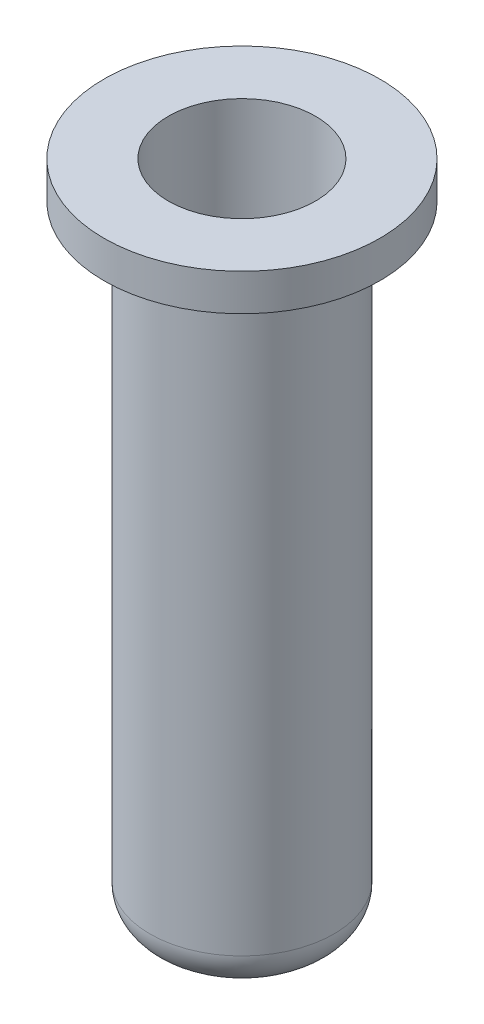
ISO-10303-21;
HEADER;
FILE_DESCRIPTION(('STEP AP214'),'2;1');
FILE_NAME('part.step','',(''),(''),'','','');
FILE_SCHEMA(('AUTOMOTIVE_DESIGN { 1 0 10303 214 1 1 1 1 }'));
ENDSEC;
DATA;
#1=APPLICATION_CONTEXT('core data for automotive mechanical design processes');
#2=APPLICATION_PROTOCOL_DEFINITION('international standard','automotive_design',2000,#1);
#3=PRODUCT_CONTEXT('',#1,'mechanical');
#4=PRODUCT('Part','Part','',(#3));
#5=PRODUCT_RELATED_PRODUCT_CATEGORY('part','',(#4));
#6=PRODUCT_DEFINITION_FORMATION('','',#4);
#7=PRODUCT_DEFINITION_CONTEXT('part definition',#1,'design');
#8=PRODUCT_DEFINITION('design','',#6,#7);
#9=PRODUCT_DEFINITION_SHAPE('','',#8);
#10=(LENGTH_UNIT() NAMED_UNIT(*) SI_UNIT(.MILLI.,.METRE.));
#11=(NAMED_UNIT(*) PLANE_ANGLE_UNIT() SI_UNIT($,.RADIAN.));
#12=(NAMED_UNIT(*) SI_UNIT($,.STERADIAN.) SOLID_ANGLE_UNIT());
#13=UNCERTAINTY_MEASURE_WITH_UNIT(LENGTH_MEASURE(1.E-05),#10,'distance_accuracy_value','');
#14=(GEOMETRIC_REPRESENTATION_CONTEXT(3) GLOBAL_UNCERTAINTY_ASSIGNED_CONTEXT((#13)) GLOBAL_UNIT_ASSIGNED_CONTEXT((#10,
#11,#12)) REPRESENTATION_CONTEXT('',''));
#15=CARTESIAN_POINT('',(0.,0.,0.));
#16=DIRECTION('',(0.,0.,1.));
#17=DIRECTION('',(1.,0.,0.));
#18=AXIS2_PLACEMENT_3D('',#15,#16,#17);
#19=CARTESIAN_POINT('',(0.,18.,0.));
#20=DIRECTION('',(0.,-1.,0.));
#21=DIRECTION('',(0.,0.,-1.));
#22=AXIS2_PLACEMENT_3D('',#19,#20,#21);
#23=CYLINDRICAL_SURFACE('',#22,2.5);
#24=CARTESIAN_POINT('',(0.,1.,0.));
#25=DIRECTION('',(0.,1.,0.));
#26=DIRECTION('',(0.,0.,1.));
#27=AXIS2_PLACEMENT_3D('',#24,#25,#26);
#28=CIRCLE('',#27,2.5);
#29=CARTESIAN_POINT('',(0.,1.,2.5));
#30=VERTEX_POINT('',#29);
#31=EDGE_CURVE('E74',#30,#30,#28,.T.);
#32=ORIENTED_EDGE('',*,*,#31,.T.);
#33=EDGE_LOOP('',(#32));
#34=FACE_BOUND('',#33,.T.);
#35=CARTESIAN_POINT('',(0.,17.,0.));
#36=DIRECTION('',(0.,1.,0.));
#37=DIRECTION('',(0.,0.,1.));
#38=AXIS2_PLACEMENT_3D('',#35,#36,#37);
#39=CIRCLE('',#38,2.5);
#40=CARTESIAN_POINT('',(0.,17.,2.5));
#41=VERTEX_POINT('',#40);
#42=EDGE_CURVE('E11',#41,#41,#39,.T.);
#43=ORIENTED_EDGE('',*,*,#42,.F.);
#44=EDGE_LOOP('',(#43));
#45=FACE_BOUND('',#44,.T.);
#46=ADVANCED_FACE('F39',(#34,#45),#23,.T.);
#47=CARTESIAN_POINT('',(0.,0.,0.));
#48=DIRECTION('',(0.,1.,0.));
#49=DIRECTION('',(0.,0.,1.));
#50=AXIS2_PLACEMENT_3D('',#47,#48,#49);
#51=PLANE('',#50);
#52=CARTESIAN_POINT('',(0.,0.,0.));
#53=DIRECTION('',(0.,1.,0.));
#54=DIRECTION('',(0.,0.,1.));
#55=AXIS2_PLACEMENT_3D('',#52,#53,#54);
#56=CIRCLE('',#55,1.5);
#57=CARTESIAN_POINT('',(0.,0.,1.5));
#58=VERTEX_POINT('',#57);
#59=EDGE_CURVE('E47',#58,#58,#56,.F.);
#60=ORIENTED_EDGE('',*,*,#59,.T.);
#61=EDGE_LOOP('',(#60));
#62=FACE_BOUND('',#61,.T.);
#63=ADVANCED_FACE('F82',(#62),#51,.F.);
#64=CARTESIAN_POINT('',(0.,1.,0.));
#65=DIRECTION('',(0.,1.,0.));
#66=DIRECTION('',(0.,0.,1.));
#67=AXIS2_PLACEMENT_3D('',#64,#65,#66);
#68=TOROIDAL_SURFACE('',#67,1.5,1.);
#69=ORIENTED_EDGE('',*,*,#59,.F.);
#70=EDGE_LOOP('',(#69));
#71=FACE_BOUND('',#70,.T.);
#72=ORIENTED_EDGE('',*,*,#31,.F.);
#73=EDGE_LOOP('',(#72));
#74=FACE_BOUND('',#73,.T.);
#75=ADVANCED_FACE('F41',(#71,#74),#68,.T.);
#76=CARTESIAN_POINT('',(0.,17.,0.));
#77=DIRECTION('',(0.,1.,0.));
#78=DIRECTION('',(0.,0.,1.));
#79=AXIS2_PLACEMENT_3D('',#76,#77,#78);
#80=CYLINDRICAL_SURFACE('',#79,3.75);
#81=CARTESIAN_POINT('',(0.,17.,0.));
#82=DIRECTION('',(0.,1.,0.));
#83=DIRECTION('',(0.,0.,1.));
#84=AXIS2_PLACEMENT_3D('',#81,#82,#83);
#85=CIRCLE('',#84,3.75);
#86=CARTESIAN_POINT('',(0.,17.,3.75));
#87=VERTEX_POINT('',#86);
#88=EDGE_CURVE('E67',#87,#87,#85,.T.);
#89=ORIENTED_EDGE('',*,*,#88,.T.);
#90=EDGE_LOOP('',(#89));
#91=FACE_BOUND('',#90,.T.);
#92=CARTESIAN_POINT('',(0.,18.,0.));
#93=DIRECTION('',(0.,1.,0.));
#94=DIRECTION('',(0.,0.,1.));
#95=AXIS2_PLACEMENT_3D('',#92,#93,#94);
#96=CIRCLE('',#95,3.75);
#97=CARTESIAN_POINT('',(0.,18.,3.75));
#98=VERTEX_POINT('',#97);
#99=EDGE_CURVE('E61',#98,#98,#96,.T.);
#100=ORIENTED_EDGE('',*,*,#99,.F.);
#101=EDGE_LOOP('',(#100));
#102=FACE_BOUND('',#101,.T.);
#103=ADVANCED_FACE('F86',(#91,#102),#80,.T.);
#104=CARTESIAN_POINT('',(0.,17.,0.));
#105=DIRECTION('',(0.,1.,0.));
#106=DIRECTION('',(0.,0.,1.));
#107=AXIS2_PLACEMENT_3D('',#104,#105,#106);
#108=PLANE('',#107);
#109=ORIENTED_EDGE('',*,*,#42,.T.);
#110=EDGE_LOOP('',(#109));
#111=FACE_BOUND('',#110,.T.);
#112=ORIENTED_EDGE('',*,*,#88,.F.);
#113=EDGE_LOOP('',(#112));
#114=FACE_BOUND('',#113,.T.);
#115=ADVANCED_FACE('F93',(#111,#114),#108,.F.);
#116=CARTESIAN_POINT('',(0.,18.,0.));
#117=DIRECTION('',(0.,1.,0.));
#118=DIRECTION('',(0.,0.,1.));
#119=AXIS2_PLACEMENT_3D('',#116,#117,#118);
#120=PLANE('',#119);
#121=CARTESIAN_POINT('',(0.,18.,0.));
#122=DIRECTION('',(0.,1.,0.));
#123=DIRECTION('',(0.,0.,1.));
#124=AXIS2_PLACEMENT_3D('',#121,#122,#123);
#125=CIRCLE('',#124,2.);
#126=CARTESIAN_POINT('',(0.,18.,2.));
#127=VERTEX_POINT('',#126);
#128=EDGE_CURVE('E62',#127,#127,#125,.T.);
#129=ORIENTED_EDGE('',*,*,#128,.F.);
#130=EDGE_LOOP('',(#129));
#131=FACE_BOUND('',#130,.T.);
#132=ORIENTED_EDGE('',*,*,#99,.T.);
#133=EDGE_LOOP('',(#132));
#134=FACE_BOUND('',#133,.T.);
#135=ADVANCED_FACE('F54',(#131,#134),#120,.T.);
#136=CARTESIAN_POINT('',(0.,4.21410161513776,0.));
#137=DIRECTION('',(0.,1.,0.));
#138=DIRECTION('',(0.,0.,1.));
#139=AXIS2_PLACEMENT_3D('',#136,#137,#138);
#140=CONICAL_SURFACE('',#139,2.,0.523598775598296);
#141=CARTESIAN_POINT('',(0.,0.750000000000001,0.));
#142=VERTEX_POINT('',#141);
#143=VERTEX_LOOP('',#142);
#144=FACE_BOUND('',#143,.T.);
#145=CARTESIAN_POINT('',(0.,4.21410161513776,0.));
#146=DIRECTION('',(0.,1.,0.));
#147=DIRECTION('',(0.,0.,1.));
#148=AXIS2_PLACEMENT_3D('',#145,#146,#147);
#149=CIRCLE('',#148,2.);
#150=CARTESIAN_POINT('',(0.,4.21410161513776,2.));
#151=VERTEX_POINT('',#150);
#152=EDGE_CURVE('E58',#151,#151,#149,.T.);
#153=ORIENTED_EDGE('',*,*,#152,.T.);
#154=EDGE_LOOP('',(#153));
#155=FACE_BOUND('',#154,.T.);
#156=ADVANCED_FACE('F50',(#144,#155),#140,.F.);
#157=CARTESIAN_POINT('',(0.,18.,0.));
#158=DIRECTION('',(0.,1.,0.));
#159=DIRECTION('',(0.,0.,1.));
#160=AXIS2_PLACEMENT_3D('',#157,#158,#159);
#161=CYLINDRICAL_SURFACE('',#160,2.);
#162=ORIENTED_EDGE('',*,*,#152,.F.);
#163=EDGE_LOOP('',(#162));
#164=FACE_BOUND('',#163,.T.);
#165=ORIENTED_EDGE('',*,*,#128,.T.);
#166=EDGE_LOOP('',(#165));
#167=FACE_BOUND('',#166,.T.);
#168=ADVANCED_FACE('F53',(#164,#167),#161,.F.);
#169=CLOSED_SHELL('',(#46,#63,#75,#103,#115,#135,#156,#168));
#170=MANIFOLD_SOLID_BREP('B2',#169);
#171=ADVANCED_BREP_SHAPE_REPRESENTATION('',(#18,#170),#14);
#172=SHAPE_DEFINITION_REPRESENTATION(#9,#171);
ENDSEC;
END-ISO-10303-21;
